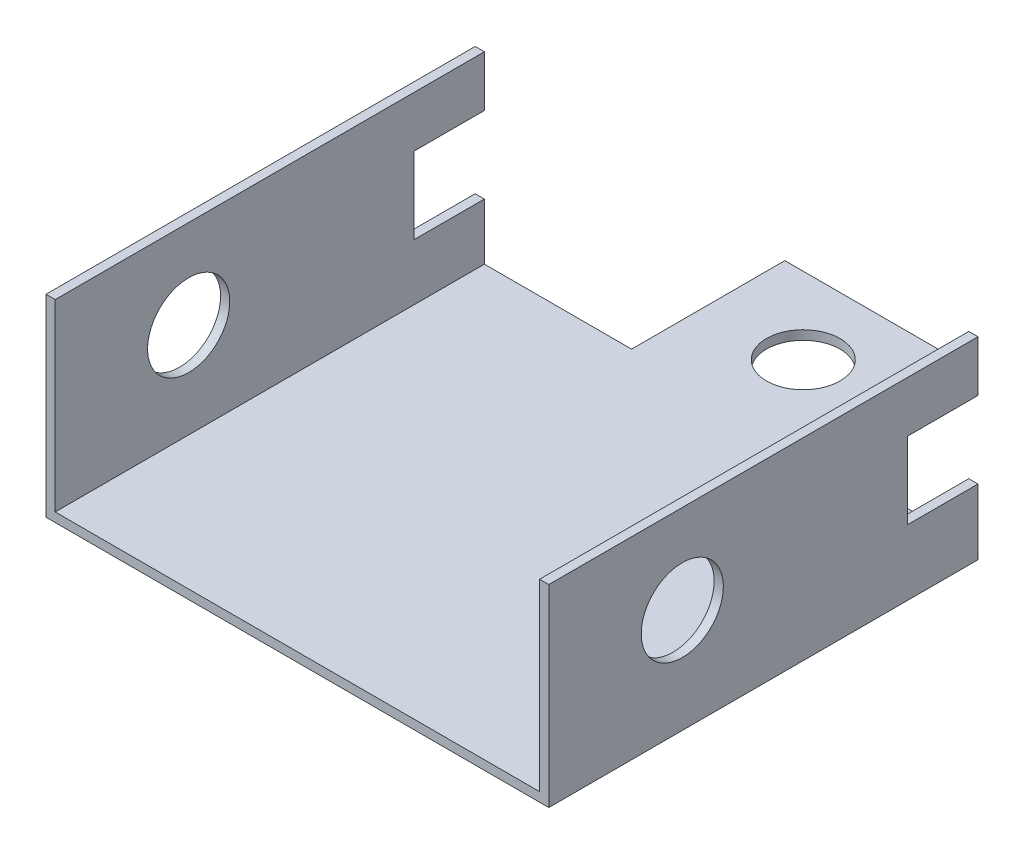
ISO-10303-21;
HEADER;
FILE_DESCRIPTION(('STEP AP214'),'2;1');
FILE_NAME('part.step','',(''),(''),'','','');
FILE_SCHEMA(('AUTOMOTIVE_DESIGN { 1 0 10303 214 1 1 1 1 }'));
ENDSEC;
DATA;
#1=APPLICATION_CONTEXT('core data for automotive mechanical design processes');
#2=APPLICATION_PROTOCOL_DEFINITION('international standard','automotive_design',2000,#1);
#3=PRODUCT_CONTEXT('',#1,'mechanical');
#4=PRODUCT('Part','Part','',(#3));
#5=PRODUCT_RELATED_PRODUCT_CATEGORY('part','',(#4));
#6=PRODUCT_DEFINITION_FORMATION('','',#4);
#7=PRODUCT_DEFINITION_CONTEXT('part definition',#1,'design');
#8=PRODUCT_DEFINITION('design','',#6,#7);
#9=PRODUCT_DEFINITION_SHAPE('','',#8);
#10=(LENGTH_UNIT() NAMED_UNIT(*) SI_UNIT(.MILLI.,.METRE.));
#11=(NAMED_UNIT(*) PLANE_ANGLE_UNIT() SI_UNIT($,.RADIAN.));
#12=(NAMED_UNIT(*) SI_UNIT($,.STERADIAN.) SOLID_ANGLE_UNIT());
#13=UNCERTAINTY_MEASURE_WITH_UNIT(LENGTH_MEASURE(1.E-05),#10,'distance_accuracy_value','');
#14=(GEOMETRIC_REPRESENTATION_CONTEXT(3) GLOBAL_UNCERTAINTY_ASSIGNED_CONTEXT((#13)) GLOBAL_UNIT_ASSIGNED_CONTEXT((#10,
#11,#12)) REPRESENTATION_CONTEXT('',''));
#15=CARTESIAN_POINT('',(0.,0.,0.));
#16=DIRECTION('',(0.,0.,1.));
#17=DIRECTION('',(1.,0.,0.));
#18=AXIS2_PLACEMENT_3D('',#15,#16,#17);
#19=CARTESIAN_POINT('',(-27.7292319944254,1.5,-11.9300184162063));
#20=DIRECTION('',(0.,0.,1.));
#21=DIRECTION('',(1.,0.,0.));
#22=AXIS2_PLACEMENT_3D('',#19,#20,#21);
#23=PLANE('',#22);
#24=DIRECTION('',(-1.,0.,0.));
#25=VECTOR('',#24,1.);
#26=CARTESIAN_POINT('',(-27.7292319944254,1.5,-11.9300184162063));
#27=LINE('',#26,#25);
#28=CARTESIAN_POINT('',(-2.22923199442536,1.5,-11.9300184162063));
#29=VERTEX_POINT('',#28);
#30=CARTESIAN_POINT('',(-26.2292319944254,1.5,-11.9300184162063));
#31=VERTEX_POINT('',#30);
#32=EDGE_CURVE('E56',#29,#31,#27,.T.);
#33=ORIENTED_EDGE('',*,*,#32,.F.);
#34=DIRECTION('',(0.,1.,0.));
#35=VECTOR('',#34,1.);
#36=CARTESIAN_POINT('',(-2.22923199442536,0.,-11.9300184162063));
#37=LINE('',#36,#35);
#38=CARTESIAN_POINT('',(-2.22923199442536,0.,-11.9300184162063));
#39=VERTEX_POINT('',#38);
#40=EDGE_CURVE('E195',#39,#29,#37,.T.);
#41=ORIENTED_EDGE('',*,*,#40,.F.);
#42=DIRECTION('',(-1.,0.,0.));
#43=VECTOR('',#42,1.);
#44=CARTESIAN_POINT('',(-27.7292319944254,0.,-11.9300184162063));
#45=LINE('',#44,#43);
#46=CARTESIAN_POINT('',(-27.7292319944254,0.,-11.9300184162063));
#47=VERTEX_POINT('',#46);
#48=EDGE_CURVE('E180',#39,#47,#45,.T.);
#49=ORIENTED_EDGE('',*,*,#48,.T.);
#50=DIRECTION('',(0.,-1.,0.));
#51=VECTOR('',#50,1.);
#52=CARTESIAN_POINT('',(-27.7292319944254,1.5,-11.9300184162063));
#53=LINE('',#52,#51);
#54=CARTESIAN_POINT('',(-27.7292319944254,10.7,-11.9300184162063));
#55=VERTEX_POINT('',#54);
#56=EDGE_CURVE('E359',#55,#47,#53,.T.);
#57=ORIENTED_EDGE('',*,*,#56,.F.);
#58=DIRECTION('',(1.,0.,0.));
#59=VECTOR('',#58,1.);
#60=CARTESIAN_POINT('',(-35.7292319944254,10.7,-11.9300184162063));
#61=LINE('',#60,#59);
#62=CARTESIAN_POINT('',(-26.2292319944254,10.7,-11.9300184162063));
#63=VERTEX_POINT('',#62);
#64=EDGE_CURVE('E263',#55,#63,#61,.T.);
#65=ORIENTED_EDGE('',*,*,#64,.T.);
#66=DIRECTION('',(0.,-1.,0.));
#67=VECTOR('',#66,1.);
#68=CARTESIAN_POINT('',(-26.2292319944254,31.5,-11.9300184162063));
#69=LINE('',#68,#67);
#70=EDGE_CURVE('E314',#63,#31,#69,.T.);
#71=ORIENTED_EDGE('',*,*,#70,.T.);
#72=EDGE_LOOP('',(#33,#41,#49,#57,#65,#71));
#73=FACE_BOUND('',#72,.T.);
#74=ADVANCED_FACE('F39',(#73),#23,.F.);
#75=CARTESIAN_POINT('',(54.2707680055746,0.,-11.9300184162063));
#76=VERTEX_POINT('',#75);
#77=CARTESIAN_POINT('',(28.7707680055746,0.,-11.9300184162063));
#78=VERTEX_POINT('',#77);
#79=EDGE_CURVE('E192',#76,#78,#45,.T.);
#80=ORIENTED_EDGE('',*,*,#79,.T.);
#81=DIRECTION('',(0.,1.,0.));
#82=VECTOR('',#81,1.);
#83=CARTESIAN_POINT('',(28.7707680055746,0.,-11.9300184162063));
#84=LINE('',#83,#82);
#85=CARTESIAN_POINT('',(28.7707680055746,1.5,-11.9300184162063));
#86=VERTEX_POINT('',#85);
#87=EDGE_CURVE('E64',#78,#86,#84,.T.);
#88=ORIENTED_EDGE('',*,*,#87,.T.);
#89=CARTESIAN_POINT('',(52.7707680055746,1.5,-11.9300184162063));
#90=VERTEX_POINT('',#89);
#91=EDGE_CURVE('E356',#90,#86,#27,.T.);
#92=ORIENTED_EDGE('',*,*,#91,.F.);
#93=DIRECTION('',(0.,-1.,0.));
#94=VECTOR('',#93,1.);
#95=CARTESIAN_POINT('',(52.7707680055746,31.5,-11.9300184162063));
#96=LINE('',#95,#94);
#97=CARTESIAN_POINT('',(52.7707680055746,10.7,-11.9300184162063));
#98=VERTEX_POINT('',#97);
#99=EDGE_CURVE('E348',#98,#90,#96,.T.);
#100=ORIENTED_EDGE('',*,*,#99,.F.);
#101=CARTESIAN_POINT('',(54.2707680055746,10.7,-11.9300184162063));
#102=VERTEX_POINT('',#101);
#103=EDGE_CURVE('E259',#98,#102,#61,.T.);
#104=ORIENTED_EDGE('',*,*,#103,.T.);
#105=DIRECTION('',(0.,-1.,0.));
#106=VECTOR('',#105,1.);
#107=CARTESIAN_POINT('',(54.2707680055746,1.5,-11.9300184162063));
#108=LINE('',#107,#106);
#109=EDGE_CURVE('E373',#102,#76,#108,.T.);
#110=ORIENTED_EDGE('',*,*,#109,.T.);
#111=EDGE_LOOP('',(#80,#88,#92,#100,#104,#110));
#112=FACE_BOUND('',#111,.T.);
#113=ADVANCED_FACE('F475',(#112),#23,.F.);
#114=CARTESIAN_POINT('',(54.2707680055746,31.5,-11.9300184162063));
#115=VERTEX_POINT('',#114);
#116=CARTESIAN_POINT('',(54.2707680055746,23.2,-11.9300184162063));
#117=VERTEX_POINT('',#116);
#118=EDGE_CURVE('E374',#115,#117,#108,.T.);
#119=ORIENTED_EDGE('',*,*,#118,.T.);
#120=DIRECTION('',(1.,0.,0.));
#121=VECTOR('',#120,1.);
#122=CARTESIAN_POINT('',(-35.7292319944254,23.2,-11.9300184162063));
#123=LINE('',#122,#121);
#124=CARTESIAN_POINT('',(52.7707680055746,23.2,-11.9300184162063));
#125=VERTEX_POINT('',#124);
#126=EDGE_CURVE('E258',#125,#117,#123,.T.);
#127=ORIENTED_EDGE('',*,*,#126,.F.);
#128=CARTESIAN_POINT('',(52.7707680055746,31.5,-11.9300184162063));
#129=VERTEX_POINT('',#128);
#130=EDGE_CURVE('E349',#129,#125,#96,.T.);
#131=ORIENTED_EDGE('',*,*,#130,.F.);
#132=DIRECTION('',(-1.,0.,0.));
#133=VECTOR('',#132,1.);
#134=CARTESIAN_POINT('',(54.2707680055746,31.5,-11.9300184162063));
#135=LINE('',#134,#133);
#136=EDGE_CURVE('E331',#115,#129,#135,.T.);
#137=ORIENTED_EDGE('',*,*,#136,.F.);
#138=EDGE_LOOP('',(#119,#127,#131,#137));
#139=FACE_BOUND('',#138,.T.);
#140=ADVANCED_FACE('F481',(#139),#23,.F.);
#141=CARTESIAN_POINT('',(0.,1.5,0.));
#142=DIRECTION('',(0.,1.,0.));
#143=DIRECTION('',(0.,0.,1.));
#144=AXIS2_PLACEMENT_3D('',#141,#142,#143);
#145=PLANE('',#144);
#146=ORIENTED_EDGE('',*,*,#91,.T.);
#147=DIRECTION('',(0.,0.,-1.));
#148=VECTOR('',#147,1.);
#149=CARTESIAN_POINT('',(28.7707680055746,1.5,-11.9300184162063));
#150=LINE('',#149,#148);
#151=CARTESIAN_POINT('',(28.7707680055746,1.5,-36.9300184162063));
#152=VERTEX_POINT('',#151);
#153=EDGE_CURVE('E213',#86,#152,#150,.T.);
#154=ORIENTED_EDGE('',*,*,#153,.T.);
#155=DIRECTION('',(-1.,0.,0.));
#156=VECTOR('',#155,1.);
#157=CARTESIAN_POINT('',(-2.22923199442537,1.5,-36.9300184162063));
#158=LINE('',#157,#156);
#159=CARTESIAN_POINT('',(-2.22923199442537,1.5,-36.9300184162063));
#160=VERTEX_POINT('',#159);
#161=EDGE_CURVE('E206',#152,#160,#158,.T.);
#162=ORIENTED_EDGE('',*,*,#161,.T.);
#163=DIRECTION('',(0.,0.,1.));
#164=VECTOR('',#163,1.);
#165=CARTESIAN_POINT('',(-2.22923199442536,1.5,-11.9300184162063));
#166=LINE('',#165,#164);
#167=EDGE_CURVE('E221',#160,#29,#166,.T.);
#168=ORIENTED_EDGE('',*,*,#167,.T.);
#169=ORIENTED_EDGE('',*,*,#32,.T.);
#170=DIRECTION('',(0.,0.,-1.));
#171=VECTOR('',#170,1.);
#172=CARTESIAN_POINT('',(-26.2292319944254,1.5,-11.9300184162063));
#173=LINE('',#172,#171);
#174=CARTESIAN_POINT('',(-26.2292319944254,1.5,58.0699815837937));
#175=VERTEX_POINT('',#174);
#176=EDGE_CURVE('E299',#175,#31,#173,.T.);
#177=ORIENTED_EDGE('',*,*,#176,.F.);
#178=DIRECTION('',(1.,0.,0.));
#179=VECTOR('',#178,1.);
#180=CARTESIAN_POINT('',(-27.7292319944254,1.5,58.0699815837937));
#181=LINE('',#180,#179);
#182=CARTESIAN_POINT('',(52.7707680055746,1.5,58.0699815837937));
#183=VERTEX_POINT('',#182);
#184=EDGE_CURVE('E353',#175,#183,#181,.T.);
#185=ORIENTED_EDGE('',*,*,#184,.T.);
#186=DIRECTION('',(0.,0.,1.));
#187=VECTOR('',#186,1.);
#188=CARTESIAN_POINT('',(52.7707680055746,1.5,-11.9300184162063));
#189=LINE('',#188,#187);
#190=EDGE_CURVE('E326',#90,#183,#189,.T.);
#191=ORIENTED_EDGE('',*,*,#190,.F.);
#192=EDGE_LOOP('',(#146,#154,#162,#168,#169,#177,#185,#191));
#193=FACE_BOUND('',#192,.T.);
#194=CARTESIAN_POINT('',(13.2707680055746,1.5,-24.4300184162063));
#195=DIRECTION('',(0.,1.,0.));
#196=DIRECTION('',(0.,0.,1.));
#197=AXIS2_PLACEMENT_3D('',#194,#195,#196);
#198=CIRCLE('',#197,6.);
#199=CARTESIAN_POINT('',(13.2707680055746,1.5,-18.4300184162063));
#200=VERTEX_POINT('',#199);
#201=EDGE_CURVE('E216',#200,#200,#198,.T.);
#202=ORIENTED_EDGE('',*,*,#201,.F.);
#203=EDGE_LOOP('',(#202));
#204=FACE_BOUND('',#203,.T.);
#205=ADVANCED_FACE('F425',(#193,#204),#145,.T.);
#206=CARTESIAN_POINT('',(-27.7292319944254,1.5,-11.9300184162063));
#207=DIRECTION('',(1.,0.,0.));
#208=DIRECTION('',(0.,0.,-1.));
#209=AXIS2_PLACEMENT_3D('',#206,#207,#208);
#210=PLANE('',#209);
#211=CARTESIAN_POINT('',(-27.7292319944254,17.,36.3018434627654));
#212=DIRECTION('',(1.,0.,0.));
#213=DIRECTION('',(0.,0.,-1.));
#214=AXIS2_PLACEMENT_3D('',#211,#212,#213);
#215=CIRCLE('',#214,6.7);
#216=CARTESIAN_POINT('',(-27.7292319944254,17.,29.6018434627654));
#217=VERTEX_POINT('',#216);
#218=EDGE_CURVE('E243',#217,#217,#215,.T.);
#219=ORIENTED_EDGE('',*,*,#218,.T.);
#220=EDGE_LOOP('',(#219));
#221=FACE_BOUND('',#220,.T.);
#222=DIRECTION('',(0.,-1.,0.));
#223=VECTOR('',#222,1.);
#224=CARTESIAN_POINT('',(-27.7292319944254,1.5,-0.430018416206268));
#225=LINE('',#224,#223);
#226=CARTESIAN_POINT('',(-27.7292319944254,23.2,-0.430018416206265));
#227=VERTEX_POINT('',#226);
#228=CARTESIAN_POINT('',(-27.7292319944254,10.7,-0.430018416206266));
#229=VERTEX_POINT('',#228);
#230=EDGE_CURVE('E287',#227,#229,#225,.T.);
#231=ORIENTED_EDGE('',*,*,#230,.T.);
#232=DIRECTION('',(0.,0.,-1.));
#233=VECTOR('',#232,1.);
#234=CARTESIAN_POINT('',(-27.7292319944254,10.7,-11.9300184162063));
#235=LINE('',#234,#233);
#236=EDGE_CURVE('E295',#229,#55,#235,.T.);
#237=ORIENTED_EDGE('',*,*,#236,.T.);
#238=ORIENTED_EDGE('',*,*,#56,.T.);
#239=DIRECTION('',(0.,0.,1.));
#240=VECTOR('',#239,1.);
#241=CARTESIAN_POINT('',(-27.7292319944254,0.,-11.9300184162063));
#242=LINE('',#241,#240);
#243=CARTESIAN_POINT('',(-27.7292319944254,0.,58.0699815837937));
#244=VERTEX_POINT('',#243);
#245=EDGE_CURVE('E188',#47,#244,#242,.T.);
#246=ORIENTED_EDGE('',*,*,#245,.T.);
#247=DIRECTION('',(0.,-1.,0.));
#248=VECTOR('',#247,1.);
#249=CARTESIAN_POINT('',(-27.7292319944254,1.5,58.0699815837937));
#250=LINE('',#249,#248);
#251=CARTESIAN_POINT('',(-27.7292319944254,31.5,58.0699815837937));
#252=VERTEX_POINT('',#251);
#253=EDGE_CURVE('E382',#252,#244,#250,.T.);
#254=ORIENTED_EDGE('',*,*,#253,.F.);
#255=DIRECTION('',(0.,0.,1.));
#256=VECTOR('',#255,1.);
#257=CARTESIAN_POINT('',(-27.7292319944254,31.5,-11.9300184162063));
#258=LINE('',#257,#256);
#259=CARTESIAN_POINT('',(-27.7292319944254,31.5,-11.9300184162063));
#260=VERTEX_POINT('',#259);
#261=EDGE_CURVE('E300',#260,#252,#258,.T.);
#262=ORIENTED_EDGE('',*,*,#261,.F.);
#263=CARTESIAN_POINT('',(-27.7292319944254,23.2,-11.9300184162063));
#264=VERTEX_POINT('',#263);
#265=EDGE_CURVE('E369',#260,#264,#53,.T.);
#266=ORIENTED_EDGE('',*,*,#265,.T.);
#267=DIRECTION('',(0.,0.,1.));
#268=VECTOR('',#267,1.);
#269=CARTESIAN_POINT('',(-27.7292319944254,23.2,-11.9300184162063));
#270=LINE('',#269,#268);
#271=EDGE_CURVE('E279',#264,#227,#270,.T.);
#272=ORIENTED_EDGE('',*,*,#271,.T.);
#273=EDGE_LOOP('',(#231,#237,#238,#246,#254,#262,#266,#272));
#274=FACE_BOUND('',#273,.T.);
#275=ADVANCED_FACE('F41',(#221,#274),#210,.F.);
#276=CARTESIAN_POINT('',(-27.7292319944254,1.5,58.0699815837937));
#277=DIRECTION('',(0.,0.,-1.));
#278=DIRECTION('',(-1.,0.,0.));
#279=AXIS2_PLACEMENT_3D('',#276,#277,#278);
#280=PLANE('',#279);
#281=DIRECTION('',(1.,0.,0.));
#282=VECTOR('',#281,1.);
#283=CARTESIAN_POINT('',(-27.7292319944254,0.,58.0699815837937));
#284=LINE('',#283,#282);
#285=CARTESIAN_POINT('',(54.2707680055746,0.,58.0699815837937));
#286=VERTEX_POINT('',#285);
#287=EDGE_CURVE('E362',#244,#286,#284,.T.);
#288=ORIENTED_EDGE('',*,*,#287,.T.);
#289=DIRECTION('',(0.,-1.,0.));
#290=VECTOR('',#289,1.);
#291=CARTESIAN_POINT('',(54.2707680055746,1.5,58.0699815837937));
#292=LINE('',#291,#290);
#293=CARTESIAN_POINT('',(54.2707680055746,31.5,58.0699815837937));
#294=VERTEX_POINT('',#293);
#295=EDGE_CURVE('E378',#294,#286,#292,.T.);
#296=ORIENTED_EDGE('',*,*,#295,.F.);
#297=DIRECTION('',(1.,0.,0.));
#298=VECTOR('',#297,1.);
#299=CARTESIAN_POINT('',(54.2707680055746,31.5,58.0699815837937));
#300=LINE('',#299,#298);
#301=CARTESIAN_POINT('',(52.7707680055746,31.5,58.0699815837937));
#302=VERTEX_POINT('',#301);
#303=EDGE_CURVE('E337',#302,#294,#300,.T.);
#304=ORIENTED_EDGE('',*,*,#303,.F.);
#305=DIRECTION('',(0.,-1.,0.));
#306=VECTOR('',#305,1.);
#307=CARTESIAN_POINT('',(52.7707680055746,31.5,58.0699815837937));
#308=LINE('',#307,#306);
#309=EDGE_CURVE('E341',#302,#183,#308,.T.);
#310=ORIENTED_EDGE('',*,*,#309,.T.);
#311=ORIENTED_EDGE('',*,*,#184,.F.);
#312=DIRECTION('',(0.,-1.,0.));
#313=VECTOR('',#312,1.);
#314=CARTESIAN_POINT('',(-26.2292319944254,31.5,58.0699815837937));
#315=LINE('',#314,#313);
#316=CARTESIAN_POINT('',(-26.2292319944254,31.5,58.0699815837937));
#317=VERTEX_POINT('',#316);
#318=EDGE_CURVE('E322',#317,#175,#315,.T.);
#319=ORIENTED_EDGE('',*,*,#318,.F.);
#320=DIRECTION('',(1.,0.,0.));
#321=VECTOR('',#320,1.);
#322=CARTESIAN_POINT('',(-27.7292319944254,31.5,58.0699815837937));
#323=LINE('',#322,#321);
#324=EDGE_CURVE('E304',#252,#317,#323,.T.);
#325=ORIENTED_EDGE('',*,*,#324,.F.);
#326=ORIENTED_EDGE('',*,*,#253,.T.);
#327=EDGE_LOOP('',(#288,#296,#304,#310,#311,#319,#325,#326));
#328=FACE_BOUND('',#327,.T.);
#329=ADVANCED_FACE('F424',(#328),#280,.F.);
#330=CARTESIAN_POINT('',(54.2707680055746,1.5,-11.9300184162063));
#331=DIRECTION('',(-1.,0.,0.));
#332=DIRECTION('',(0.,0.,1.));
#333=AXIS2_PLACEMENT_3D('',#330,#331,#332);
#334=PLANE('',#333);
#335=CARTESIAN_POINT('',(54.2707680055746,17.,36.3018434627654));
#336=DIRECTION('',(1.,0.,0.));
#337=DIRECTION('',(0.,0.,-1.));
#338=AXIS2_PLACEMENT_3D('',#335,#336,#337);
#339=CIRCLE('',#338,6.7);
#340=CARTESIAN_POINT('',(54.2707680055746,17.,29.6018434627654));
#341=VERTEX_POINT('',#340);
#342=EDGE_CURVE('E230',#341,#341,#339,.T.);
#343=ORIENTED_EDGE('',*,*,#342,.F.);
#344=EDGE_LOOP('',(#343));
#345=FACE_BOUND('',#344,.T.);
#346=ORIENTED_EDGE('',*,*,#109,.F.);
#347=DIRECTION('',(0.,0.,-1.));
#348=VECTOR('',#347,1.);
#349=CARTESIAN_POINT('',(54.2707680055746,10.7,-11.9300184162063));
#350=LINE('',#349,#348);
#351=CARTESIAN_POINT('',(54.2707680055746,10.7,-0.430018416206266));
#352=VERTEX_POINT('',#351);
#353=EDGE_CURVE('E255',#352,#102,#350,.T.);
#354=ORIENTED_EDGE('',*,*,#353,.F.);
#355=DIRECTION('',(0.,-1.,0.));
#356=VECTOR('',#355,1.);
#357=CARTESIAN_POINT('',(54.2707680055746,23.2,-0.430018416206265));
#358=LINE('',#357,#356);
#359=CARTESIAN_POINT('',(54.2707680055746,23.2,-0.430018416206265));
#360=VERTEX_POINT('',#359);
#361=EDGE_CURVE('E251',#360,#352,#358,.T.);
#362=ORIENTED_EDGE('',*,*,#361,.F.);
#363=DIRECTION('',(0.,0.,1.));
#364=VECTOR('',#363,1.);
#365=CARTESIAN_POINT('',(54.2707680055746,23.2,-11.9300184162063));
#366=LINE('',#365,#364);
#367=EDGE_CURVE('E247',#117,#360,#366,.T.);
#368=ORIENTED_EDGE('',*,*,#367,.F.);
#369=ORIENTED_EDGE('',*,*,#118,.F.);
#370=DIRECTION('',(0.,0.,-1.));
#371=VECTOR('',#370,1.);
#372=CARTESIAN_POINT('',(54.2707680055746,31.5,-11.9300184162063));
#373=LINE('',#372,#371);
#374=EDGE_CURVE('E327',#294,#115,#373,.T.);
#375=ORIENTED_EDGE('',*,*,#374,.F.);
#376=ORIENTED_EDGE('',*,*,#295,.T.);
#377=DIRECTION('',(0.,0.,-1.));
#378=VECTOR('',#377,1.);
#379=CARTESIAN_POINT('',(54.2707680055746,0.,-11.9300184162063));
#380=LINE('',#379,#378);
#381=EDGE_CURVE('E193',#286,#76,#380,.T.);
#382=ORIENTED_EDGE('',*,*,#381,.T.);
#383=EDGE_LOOP('',(#346,#354,#362,#368,#369,#375,#376,#382));
#384=FACE_BOUND('',#383,.T.);
#385=ADVANCED_FACE('F485',(#345,#384),#334,.F.);
#386=CARTESIAN_POINT('',(-26.2292319944254,31.5,-11.9300184162063));
#387=VERTEX_POINT('',#386);
#388=CARTESIAN_POINT('',(-26.2292319944254,23.2,-11.9300184162063));
#389=VERTEX_POINT('',#388);
#390=EDGE_CURVE('E318',#387,#389,#69,.T.);
#391=ORIENTED_EDGE('',*,*,#390,.T.);
#392=EDGE_CURVE('E272',#264,#389,#123,.T.);
#393=ORIENTED_EDGE('',*,*,#392,.F.);
#394=ORIENTED_EDGE('',*,*,#265,.F.);
#395=DIRECTION('',(-1.,0.,0.));
#396=VECTOR('',#395,1.);
#397=CARTESIAN_POINT('',(-27.7292319944254,31.5,-11.9300184162063));
#398=LINE('',#397,#396);
#399=EDGE_CURVE('E310',#387,#260,#398,.T.);
#400=ORIENTED_EDGE('',*,*,#399,.F.);
#401=EDGE_LOOP('',(#391,#393,#394,#400));
#402=FACE_BOUND('',#401,.T.);
#403=ADVANCED_FACE('F430',(#402),#23,.F.);
#404=CARTESIAN_POINT('',(0.,0.,0.));
#405=DIRECTION('',(0.,1.,0.));
#406=DIRECTION('',(0.,0.,1.));
#407=AXIS2_PLACEMENT_3D('',#404,#405,#406);
#408=PLANE('',#407);
#409=ORIENTED_EDGE('',*,*,#245,.F.);
#410=ORIENTED_EDGE('',*,*,#48,.F.);
#411=DIRECTION('',(0.,0.,1.));
#412=VECTOR('',#411,1.);
#413=CARTESIAN_POINT('',(-2.22923199442536,0.,-11.9300184162063));
#414=LINE('',#413,#412);
#415=CARTESIAN_POINT('',(-2.22923199442537,0.,-36.9300184162063));
#416=VERTEX_POINT('',#415);
#417=EDGE_CURVE('E185',#416,#39,#414,.T.);
#418=ORIENTED_EDGE('',*,*,#417,.F.);
#419=DIRECTION('',(-1.,0.,0.));
#420=VECTOR('',#419,1.);
#421=CARTESIAN_POINT('',(-2.22923199442537,0.,-36.9300184162063));
#422=LINE('',#421,#420);
#423=CARTESIAN_POINT('',(28.7707680055746,0.,-36.9300184162063));
#424=VERTEX_POINT('',#423);
#425=EDGE_CURVE('E200',#424,#416,#422,.T.);
#426=ORIENTED_EDGE('',*,*,#425,.F.);
#427=DIRECTION('',(0.,0.,-1.));
#428=VECTOR('',#427,1.);
#429=CARTESIAN_POINT('',(28.7707680055746,0.,-11.9300184162063));
#430=LINE('',#429,#428);
#431=EDGE_CURVE('E205',#78,#424,#430,.T.);
#432=ORIENTED_EDGE('',*,*,#431,.F.);
#433=ORIENTED_EDGE('',*,*,#79,.F.);
#434=ORIENTED_EDGE('',*,*,#381,.F.);
#435=ORIENTED_EDGE('',*,*,#287,.F.);
#436=EDGE_LOOP('',(#409,#410,#418,#426,#432,#433,#434,#435));
#437=FACE_BOUND('',#436,.T.);
#438=CARTESIAN_POINT('',(13.2707680055746,0.,-24.4300184162063));
#439=DIRECTION('',(0.,1.,0.));
#440=DIRECTION('',(0.,0.,1.));
#441=AXIS2_PLACEMENT_3D('',#438,#439,#440);
#442=CIRCLE('',#441,6.);
#443=CARTESIAN_POINT('',(13.2707680055746,0.,-18.4300184162063));
#444=VERTEX_POINT('',#443);
#445=EDGE_CURVE('E224',#444,#444,#442,.T.);
#446=ORIENTED_EDGE('',*,*,#445,.T.);
#447=EDGE_LOOP('',(#446));
#448=FACE_BOUND('',#447,.T.);
#449=ADVANCED_FACE('F181',(#437,#448),#408,.F.);
#450=CARTESIAN_POINT('',(52.7707680055746,31.5,-11.9300184162063));
#451=DIRECTION('',(1.,0.,0.));
#452=DIRECTION('',(0.,0.,-1.));
#453=AXIS2_PLACEMENT_3D('',#450,#451,#452);
#454=PLANE('',#453);
#455=CARTESIAN_POINT('',(52.7707680055746,17.,36.3018434627654));
#456=DIRECTION('',(1.,0.,0.));
#457=DIRECTION('',(0.,0.,-1.));
#458=AXIS2_PLACEMENT_3D('',#455,#456,#457);
#459=CIRCLE('',#458,6.7);
#460=CARTESIAN_POINT('',(52.7707680055746,17.,29.6018434627654));
#461=VERTEX_POINT('',#460);
#462=EDGE_CURVE('E239',#461,#461,#459,.T.);
#463=ORIENTED_EDGE('',*,*,#462,.T.);
#464=EDGE_LOOP('',(#463));
#465=FACE_BOUND('',#464,.T.);
#466=DIRECTION('',(0.,-1.,0.));
#467=VECTOR('',#466,1.);
#468=CARTESIAN_POINT('',(52.7707680055746,31.5,-0.430018416206263));
#469=LINE('',#468,#467);
#470=CARTESIAN_POINT('',(52.7707680055746,23.2,-0.430018416206265));
#471=VERTEX_POINT('',#470);
#472=CARTESIAN_POINT('',(52.7707680055746,10.7,-0.430018416206266));
#473=VERTEX_POINT('',#472);
#474=EDGE_CURVE('E283',#471,#473,#469,.T.);
#475=ORIENTED_EDGE('',*,*,#474,.T.);
#476=DIRECTION('',(0.,0.,-1.));
#477=VECTOR('',#476,1.);
#478=CARTESIAN_POINT('',(52.7707680055746,10.7,-11.9300184162063));
#479=LINE('',#478,#477);
#480=EDGE_CURVE('E291',#473,#98,#479,.T.);
#481=ORIENTED_EDGE('',*,*,#480,.T.);
#482=ORIENTED_EDGE('',*,*,#99,.T.);
#483=ORIENTED_EDGE('',*,*,#190,.T.);
#484=ORIENTED_EDGE('',*,*,#309,.F.);
#485=DIRECTION('',(0.,0.,1.));
#486=VECTOR('',#485,1.);
#487=CARTESIAN_POINT('',(52.7707680055746,31.5,-11.9300184162063));
#488=LINE('',#487,#486);
#489=EDGE_CURVE('E334',#129,#302,#488,.T.);
#490=ORIENTED_EDGE('',*,*,#489,.F.);
#491=ORIENTED_EDGE('',*,*,#130,.T.);
#492=DIRECTION('',(0.,0.,1.));
#493=VECTOR('',#492,1.);
#494=CARTESIAN_POINT('',(52.7707680055746,23.2,-11.9300184162063));
#495=LINE('',#494,#493);
#496=EDGE_CURVE('E275',#125,#471,#495,.T.);
#497=ORIENTED_EDGE('',*,*,#496,.T.);
#498=EDGE_LOOP('',(#475,#481,#482,#483,#484,#490,#491,#497));
#499=FACE_BOUND('',#498,.T.);
#500=ADVANCED_FACE('F446',(#465,#499),#454,.F.);
#501=CARTESIAN_POINT('',(0.,31.5,0.));
#502=DIRECTION('',(0.,-1.,0.));
#503=DIRECTION('',(0.,0.,-1.));
#504=AXIS2_PLACEMENT_3D('',#501,#502,#503);
#505=PLANE('',#504);
#506=ORIENTED_EDGE('',*,*,#374,.T.);
#507=ORIENTED_EDGE('',*,*,#136,.T.);
#508=ORIENTED_EDGE('',*,*,#489,.T.);
#509=ORIENTED_EDGE('',*,*,#303,.T.);
#510=EDGE_LOOP('',(#506,#507,#508,#509));
#511=FACE_BOUND('',#510,.T.);
#512=ADVANCED_FACE('F511',(#511),#505,.F.);
#513=CARTESIAN_POINT('',(-26.2292319944254,31.5,-11.9300184162063));
#514=DIRECTION('',(-1.,0.,0.));
#515=DIRECTION('',(0.,0.,1.));
#516=AXIS2_PLACEMENT_3D('',#513,#514,#515);
#517=PLANE('',#516);
#518=CARTESIAN_POINT('',(-26.2292319944254,17.,36.3018434627654));
#519=DIRECTION('',(-1.,0.,0.));
#520=DIRECTION('',(0.,0.,1.));
#521=AXIS2_PLACEMENT_3D('',#518,#519,#520);
#522=CIRCLE('',#521,6.7);
#523=CARTESIAN_POINT('',(-26.2292319944254,17.,29.6018434627654));
#524=VERTEX_POINT('',#523);
#525=EDGE_CURVE('E43',#524,#524,#522,.T.);
#526=ORIENTED_EDGE('',*,*,#525,.T.);
#527=EDGE_LOOP('',(#526));
#528=FACE_BOUND('',#527,.T.);
#529=ORIENTED_EDGE('',*,*,#70,.F.);
#530=DIRECTION('',(0.,0.,1.));
#531=VECTOR('',#530,1.);
#532=CARTESIAN_POINT('',(-26.2292319944254,10.7,-11.9300184162063));
#533=LINE('',#532,#531);
#534=CARTESIAN_POINT('',(-26.2292319944254,10.7,-0.430018416206266));
#535=VERTEX_POINT('',#534);
#536=EDGE_CURVE('E11',#63,#535,#533,.T.);
#537=ORIENTED_EDGE('',*,*,#536,.T.);
#538=DIRECTION('',(0.,1.,0.));
#539=VECTOR('',#538,1.);
#540=CARTESIAN_POINT('',(-26.2292319944254,31.5,-0.430018416206263));
#541=LINE('',#540,#539);
#542=CARTESIAN_POINT('',(-26.2292319944254,23.2,-0.430018416206265));
#543=VERTEX_POINT('',#542);
#544=EDGE_CURVE('E49',#535,#543,#541,.T.);
#545=ORIENTED_EDGE('',*,*,#544,.T.);
#546=DIRECTION('',(0.,0.,-1.));
#547=VECTOR('',#546,1.);
#548=CARTESIAN_POINT('',(-26.2292319944254,23.2,-11.9300184162063));
#549=LINE('',#548,#547);
#550=EDGE_CURVE('E386',#543,#389,#549,.T.);
#551=ORIENTED_EDGE('',*,*,#550,.T.);
#552=ORIENTED_EDGE('',*,*,#390,.F.);
#553=DIRECTION('',(0.,0.,-1.));
#554=VECTOR('',#553,1.);
#555=CARTESIAN_POINT('',(-26.2292319944254,31.5,-11.9300184162063));
#556=LINE('',#555,#554);
#557=EDGE_CURVE('E307',#317,#387,#556,.T.);
#558=ORIENTED_EDGE('',*,*,#557,.F.);
#559=ORIENTED_EDGE('',*,*,#318,.T.);
#560=ORIENTED_EDGE('',*,*,#176,.T.);
#561=EDGE_LOOP('',(#529,#537,#545,#551,#552,#558,#559,#560));
#562=FACE_BOUND('',#561,.T.);
#563=ADVANCED_FACE('F394',(#528,#562),#517,.F.);
#564=CARTESIAN_POINT('',(0.,31.5,0.));
#565=DIRECTION('',(0.,1.,0.));
#566=DIRECTION('',(0.,0.,1.));
#567=AXIS2_PLACEMENT_3D('',#564,#565,#566);
#568=PLANE('',#567);
#569=ORIENTED_EDGE('',*,*,#261,.T.);
#570=ORIENTED_EDGE('',*,*,#324,.T.);
#571=ORIENTED_EDGE('',*,*,#557,.T.);
#572=ORIENTED_EDGE('',*,*,#399,.T.);
#573=EDGE_LOOP('',(#569,#570,#571,#572));
#574=FACE_BOUND('',#573,.T.);
#575=ADVANCED_FACE('F435',(#574),#568,.T.);
#576=CARTESIAN_POINT('',(-35.7292319944254,23.2,-11.9300184162063));
#577=DIRECTION('',(0.,1.,0.));
#578=DIRECTION('',(0.,0.,1.));
#579=AXIS2_PLACEMENT_3D('',#576,#577,#578);
#580=PLANE('',#579);
#581=ORIENTED_EDGE('',*,*,#392,.T.);
#582=ORIENTED_EDGE('',*,*,#550,.F.);
#583=DIRECTION('',(1.,0.,0.));
#584=VECTOR('',#583,1.);
#585=CARTESIAN_POINT('',(-35.7292319944254,23.2,-0.430018416206265));
#586=LINE('',#585,#584);
#587=EDGE_CURVE('E268',#227,#543,#586,.T.);
#588=ORIENTED_EDGE('',*,*,#587,.F.);
#589=ORIENTED_EDGE('',*,*,#271,.F.);
#590=EDGE_LOOP('',(#581,#582,#588,#589));
#591=FACE_BOUND('',#590,.T.);
#592=ADVANCED_FACE('F427',(#591),#580,.F.);
#593=CARTESIAN_POINT('',(-35.7292319944254,23.2,-0.430018416206265));
#594=DIRECTION('',(0.,0.,1.));
#595=DIRECTION('',(0.,-1.,0.));
#596=AXIS2_PLACEMENT_3D('',#593,#594,#595);
#597=PLANE('',#596);
#598=ORIENTED_EDGE('',*,*,#587,.T.);
#599=ORIENTED_EDGE('',*,*,#544,.F.);
#600=DIRECTION('',(1.,0.,0.));
#601=VECTOR('',#600,1.);
#602=CARTESIAN_POINT('',(-35.7292319944254,10.7,-0.430018416206266));
#603=LINE('',#602,#601);
#604=EDGE_CURVE('E264',#229,#535,#603,.T.);
#605=ORIENTED_EDGE('',*,*,#604,.F.);
#606=ORIENTED_EDGE('',*,*,#230,.F.);
#607=EDGE_LOOP('',(#598,#599,#605,#606));
#608=FACE_BOUND('',#607,.T.);
#609=ADVANCED_FACE('F400',(#608),#597,.F.);
#610=CARTESIAN_POINT('',(-35.7292319944254,10.7,-11.9300184162063));
#611=DIRECTION('',(0.,-1.,0.));
#612=DIRECTION('',(0.,0.,-1.));
#613=AXIS2_PLACEMENT_3D('',#610,#611,#612);
#614=PLANE('',#613);
#615=ORIENTED_EDGE('',*,*,#604,.T.);
#616=ORIENTED_EDGE('',*,*,#536,.F.);
#617=ORIENTED_EDGE('',*,*,#64,.F.);
#618=ORIENTED_EDGE('',*,*,#236,.F.);
#619=EDGE_LOOP('',(#615,#616,#617,#618));
#620=FACE_BOUND('',#619,.T.);
#621=ADVANCED_FACE('F403',(#620),#614,.F.);
#622=EDGE_CURVE('E265',#473,#352,#603,.T.);
#623=ORIENTED_EDGE('',*,*,#622,.T.);
#624=ORIENTED_EDGE('',*,*,#353,.T.);
#625=ORIENTED_EDGE('',*,*,#103,.F.);
#626=ORIENTED_EDGE('',*,*,#480,.F.);
#627=EDGE_LOOP('',(#623,#624,#625,#626));
#628=FACE_BOUND('',#627,.T.);
#629=ADVANCED_FACE('F513',(#628),#614,.F.);
#630=EDGE_CURVE('E269',#471,#360,#586,.T.);
#631=ORIENTED_EDGE('',*,*,#630,.T.);
#632=ORIENTED_EDGE('',*,*,#361,.T.);
#633=ORIENTED_EDGE('',*,*,#622,.F.);
#634=ORIENTED_EDGE('',*,*,#474,.F.);
#635=EDGE_LOOP('',(#631,#632,#633,#634));
#636=FACE_BOUND('',#635,.T.);
#637=ADVANCED_FACE('F516',(#636),#597,.F.);
#638=ORIENTED_EDGE('',*,*,#126,.T.);
#639=ORIENTED_EDGE('',*,*,#367,.T.);
#640=ORIENTED_EDGE('',*,*,#630,.F.);
#641=ORIENTED_EDGE('',*,*,#496,.F.);
#642=EDGE_LOOP('',(#638,#639,#640,#641));
#643=FACE_BOUND('',#642,.T.);
#644=ADVANCED_FACE('F418',(#643),#580,.F.);
#645=CARTESIAN_POINT('',(-35.7292319944254,17.,36.3018434627654));
#646=DIRECTION('',(1.,0.,0.));
#647=DIRECTION('',(0.,0.,-1.));
#648=AXIS2_PLACEMENT_3D('',#645,#646,#647);
#649=CYLINDRICAL_SURFACE('',#648,6.7);
#650=CARTESIAN_POINT('',(-26.2292319944254,17.,29.6018434627654));
#651=CARTESIAN_POINT('',(-26.2448569944254,17.,29.6018434627654));
#652=CARTESIAN_POINT('',(-26.2604819944254,17.,29.6018434627654));
#653=CARTESIAN_POINT('',(-26.2917319944254,17.,29.6018434627654));
#654=CARTESIAN_POINT('',(-26.3073569944254,17.,29.6018434627654));
#655=CARTESIAN_POINT('',(-26.3386069944254,17.,29.6018434627654));
#656=CARTESIAN_POINT('',(-26.3542319944254,17.,29.6018434627654));
#657=CARTESIAN_POINT('',(-26.3854819944254,17.,29.6018434627654));
#658=CARTESIAN_POINT('',(-26.4011069944254,17.,29.6018434627654));
#659=CARTESIAN_POINT('',(-26.4323569944254,17.,29.6018434627654));
#660=CARTESIAN_POINT('',(-26.4479819944254,17.,29.6018434627654));
#661=CARTESIAN_POINT('',(-26.4792319944254,17.,29.6018434627654));
#662=CARTESIAN_POINT('',(-26.4948569944254,17.,29.6018434627654));
#663=CARTESIAN_POINT('',(-26.5261069944254,17.,29.6018434627654));
#664=CARTESIAN_POINT('',(-26.5417319944254,17.,29.6018434627654));
#665=CARTESIAN_POINT('',(-26.5729819944254,17.,29.6018434627654));
#666=CARTESIAN_POINT('',(-26.5886069944254,17.,29.6018434627654));
#667=CARTESIAN_POINT('',(-26.6198569944254,17.,29.6018434627654));
#668=CARTESIAN_POINT('',(-26.6354819944254,17.,29.6018434627654));
#669=CARTESIAN_POINT('',(-26.6667319944254,17.,29.6018434627654));
#670=CARTESIAN_POINT('',(-26.6823569944254,17.,29.6018434627654));
#671=CARTESIAN_POINT('',(-26.7136069944254,17.,29.6018434627654));
#672=CARTESIAN_POINT('',(-26.7292319944254,17.,29.6018434627654));
#673=CARTESIAN_POINT('',(-26.7604819944254,17.,29.6018434627654));
#674=CARTESIAN_POINT('',(-26.7761069944254,17.,29.6018434627654));
#675=CARTESIAN_POINT('',(-26.8073569944254,17.,29.6018434627654));
#676=CARTESIAN_POINT('',(-26.8229819944254,17.,29.6018434627654));
#677=CARTESIAN_POINT('',(-26.8542319944254,17.,29.6018434627654));
#678=CARTESIAN_POINT('',(-26.8698569944254,17.,29.6018434627654));
#679=CARTESIAN_POINT('',(-26.9011069944254,17.,29.6018434627654));
#680=CARTESIAN_POINT('',(-26.9167319944254,17.,29.6018434627654));
#681=CARTESIAN_POINT('',(-26.9479819944254,17.,29.6018434627654));
#682=CARTESIAN_POINT('',(-26.9636069944254,17.,29.6018434627654));
#683=CARTESIAN_POINT('',(-26.9948569944254,17.,29.6018434627654));
#684=CARTESIAN_POINT('',(-27.0104819944254,17.,29.6018434627654));
#685=CARTESIAN_POINT('',(-27.0417319944254,17.,29.6018434627654));
#686=CARTESIAN_POINT('',(-27.0573569944254,17.,29.6018434627654));
#687=CARTESIAN_POINT('',(-27.0886069944254,17.,29.6018434627654));
#688=CARTESIAN_POINT('',(-27.1042319944254,17.,29.6018434627654));
#689=CARTESIAN_POINT('',(-27.1354819944254,17.,29.6018434627654));
#690=CARTESIAN_POINT('',(-27.1511069944254,17.,29.6018434627654));
#691=CARTESIAN_POINT('',(-27.1823569944254,17.,29.6018434627654));
#692=CARTESIAN_POINT('',(-27.1979819944254,17.,29.6018434627654));
#693=CARTESIAN_POINT('',(-27.2292319944254,17.,29.6018434627654));
#694=CARTESIAN_POINT('',(-27.2448569944254,17.,29.6018434627654));
#695=CARTESIAN_POINT('',(-27.2761069944254,17.,29.6018434627654));
#696=CARTESIAN_POINT('',(-27.2917319944254,17.,29.6018434627654));
#697=CARTESIAN_POINT('',(-27.3229819944254,17.,29.6018434627654));
#698=CARTESIAN_POINT('',(-27.3386069944254,17.,29.6018434627654));
#699=CARTESIAN_POINT('',(-27.3698569944254,17.,29.6018434627654));
#700=CARTESIAN_POINT('',(-27.3854819944254,17.,29.6018434627654));
#701=CARTESIAN_POINT('',(-27.4167319944254,17.,29.6018434627654));
#702=CARTESIAN_POINT('',(-27.4323569944254,17.,29.6018434627654));
#703=CARTESIAN_POINT('',(-27.4636069944254,17.,29.6018434627654));
#704=CARTESIAN_POINT('',(-27.4792319944254,17.,29.6018434627654));
#705=CARTESIAN_POINT('',(-27.5104819944254,17.,29.6018434627654));
#706=CARTESIAN_POINT('',(-27.5261069944254,17.,29.6018434627654));
#707=CARTESIAN_POINT('',(-27.5573569944254,17.,29.6018434627654));
#708=CARTESIAN_POINT('',(-27.5729819944254,17.,29.6018434627654));
#709=CARTESIAN_POINT('',(-27.6042319944254,17.,29.6018434627654));
#710=CARTESIAN_POINT('',(-27.6198569944254,17.,29.6018434627654));
#711=CARTESIAN_POINT('',(-27.6511069944254,17.,29.6018434627654));
#712=CARTESIAN_POINT('',(-27.6667319944254,17.,29.6018434627654));
#713=CARTESIAN_POINT('',(-27.6979819944254,17.,29.6018434627654));
#714=CARTESIAN_POINT('',(-27.7136069944254,17.,29.6018434627654));
#715=CARTESIAN_POINT('',(-27.7292319944254,17.,29.6018434627654));
#716=B_SPLINE_CURVE_WITH_KNOTS('',3,(#650,#651,#652,#653,#654,#655,#656,#657,#658,#659,#660,
#661,#662,#663,#664,#665,#666,#667,#668,#669,#670,#671,#672,#673,#674,#675,#676,#677,#678,#679,
#680,#681,#682,#683,#684,#685,#686,#687,#688,#689,#690,#691,#692,#693,#694,#695,#696,#697,#698,
#699,#700,#701,#702,#703,#704,#705,#706,#707,#708,#709,#710,#711,#712,#713,#714,#715),
.UNSPECIFIED.,.F.,.F.,(4,2,2,2,2,2,2,2,2,2,2,2,2,2,2,2,2,2,2,2,2,2,2,2,2,2,2,2,2,2,2,2,4),(0.,
0.0468750000000018,0.0937500000000036,0.140625000000002,0.1875,0.234375000000002,
0.281250000000004,0.328125000000005,0.375000000000004,0.421875000000002,0.468750000000004,
0.515625000000006,0.562500000000007,0.609375000000006,0.656250000000004,0.703125000000006,
0.750000000000008,0.796875000000006,0.843750000000004,0.890625000000006,0.937500000000008,
0.98437500000001,1.03125000000001,1.07812500000001,1.12500000000001,1.17187500000001,
1.21875000000001,1.26562500000001,1.31250000000001,1.35937500000001,1.40625000000001,
1.45312500000001,1.50000000000001),.UNSPECIFIED.);
#717=EDGE_CURVE('BSEAM414',#524,#217,#716,.T.);
#718=ORIENTED_EDGE('',*,*,#525,.F.);
#719=ORIENTED_EDGE('',*,*,#218,.F.);
#720=ORIENTED_EDGE('',*,*,#717,.T.);
#721=ORIENTED_EDGE('',*,*,#717,.F.);
#722=EDGE_LOOP('',(#718,#720,#719,#721));
#723=FACE_BOUND('',#722,.T.);
#724=ADVANCED_FACE('F414',(#723),#649,.F.);
#725=CARTESIAN_POINT('',(54.2707680055746,17.,29.6018434627654));
#726=CARTESIAN_POINT('',(54.2551430055746,17.,29.6018434627654));
#727=CARTESIAN_POINT('',(54.2395180055746,17.,29.6018434627654));
#728=CARTESIAN_POINT('',(54.2082680055746,17.,29.6018434627654));
#729=CARTESIAN_POINT('',(54.1926430055746,17.,29.6018434627654));
#730=CARTESIAN_POINT('',(54.1613930055746,17.,29.6018434627654));
#731=CARTESIAN_POINT('',(54.1457680055746,17.,29.6018434627654));
#732=CARTESIAN_POINT('',(54.1145180055746,17.,29.6018434627654));
#733=CARTESIAN_POINT('',(54.0988930055746,17.,29.6018434627654));
#734=CARTESIAN_POINT('',(54.0676430055746,17.,29.6018434627654));
#735=CARTESIAN_POINT('',(54.0520180055746,17.,29.6018434627654));
#736=CARTESIAN_POINT('',(54.0207680055746,17.,29.6018434627654));
#737=CARTESIAN_POINT('',(54.0051430055746,17.,29.6018434627654));
#738=CARTESIAN_POINT('',(53.9738930055746,17.,29.6018434627654));
#739=CARTESIAN_POINT('',(53.9582680055746,17.,29.6018434627654));
#740=CARTESIAN_POINT('',(53.9270180055746,17.,29.6018434627654));
#741=CARTESIAN_POINT('',(53.9113930055746,17.,29.6018434627654));
#742=CARTESIAN_POINT('',(53.8801430055746,17.,29.6018434627654));
#743=CARTESIAN_POINT('',(53.8645180055746,17.,29.6018434627654));
#744=CARTESIAN_POINT('',(53.8332680055746,17.,29.6018434627654));
#745=CARTESIAN_POINT('',(53.8176430055746,17.,29.6018434627654));
#746=CARTESIAN_POINT('',(53.7863930055746,17.,29.6018434627654));
#747=CARTESIAN_POINT('',(53.7707680055746,17.,29.6018434627654));
#748=CARTESIAN_POINT('',(53.7395180055746,17.,29.6018434627654));
#749=CARTESIAN_POINT('',(53.7238930055746,17.,29.6018434627654));
#750=CARTESIAN_POINT('',(53.6926430055746,17.,29.6018434627654));
#751=CARTESIAN_POINT('',(53.6770180055746,17.,29.6018434627654));
#752=CARTESIAN_POINT('',(53.6457680055746,17.,29.6018434627654));
#753=CARTESIAN_POINT('',(53.6301430055746,17.,29.6018434627654));
#754=CARTESIAN_POINT('',(53.5988930055746,17.,29.6018434627654));
#755=CARTESIAN_POINT('',(53.5832680055746,17.,29.6018434627654));
#756=CARTESIAN_POINT('',(53.5520180055746,17.,29.6018434627654));
#757=CARTESIAN_POINT('',(53.5363930055746,17.,29.6018434627654));
#758=CARTESIAN_POINT('',(53.5051430055746,17.,29.6018434627654));
#759=CARTESIAN_POINT('',(53.4895180055746,17.,29.6018434627654));
#760=CARTESIAN_POINT('',(53.4582680055746,17.,29.6018434627654));
#761=CARTESIAN_POINT('',(53.4426430055746,17.,29.6018434627654));
#762=CARTESIAN_POINT('',(53.4113930055746,17.,29.6018434627654));
#763=CARTESIAN_POINT('',(53.3957680055746,17.,29.6018434627654));
#764=CARTESIAN_POINT('',(53.3645180055746,17.,29.6018434627654));
#765=CARTESIAN_POINT('',(53.3488930055746,17.,29.6018434627654));
#766=CARTESIAN_POINT('',(53.3176430055746,17.,29.6018434627654));
#767=CARTESIAN_POINT('',(53.3020180055746,17.,29.6018434627654));
#768=CARTESIAN_POINT('',(53.2707680055746,17.,29.6018434627654));
#769=CARTESIAN_POINT('',(53.2551430055746,17.,29.6018434627654));
#770=CARTESIAN_POINT('',(53.2238930055746,17.,29.6018434627654));
#771=CARTESIAN_POINT('',(53.2082680055746,17.,29.6018434627654));
#772=CARTESIAN_POINT('',(53.1770180055746,17.,29.6018434627654));
#773=CARTESIAN_POINT('',(53.1613930055746,17.,29.6018434627654));
#774=CARTESIAN_POINT('',(53.1301430055746,17.,29.6018434627654));
#775=CARTESIAN_POINT('',(53.1145180055746,17.,29.6018434627654));
#776=CARTESIAN_POINT('',(53.0832680055746,17.,29.6018434627654));
#777=CARTESIAN_POINT('',(53.0676430055746,17.,29.6018434627654));
#778=CARTESIAN_POINT('',(53.0363930055746,17.,29.6018434627654));
#779=CARTESIAN_POINT('',(53.0207680055746,17.,29.6018434627654));
#780=CARTESIAN_POINT('',(52.9895180055746,17.,29.6018434627654));
#781=CARTESIAN_POINT('',(52.9738930055746,17.,29.6018434627654));
#782=CARTESIAN_POINT('',(52.9426430055746,17.,29.6018434627654));
#783=CARTESIAN_POINT('',(52.9270180055746,17.,29.6018434627654));
#784=CARTESIAN_POINT('',(52.8957680055746,17.,29.6018434627654));
#785=CARTESIAN_POINT('',(52.8801430055746,17.,29.6018434627654));
#786=CARTESIAN_POINT('',(52.8488930055746,17.,29.6018434627654));
#787=CARTESIAN_POINT('',(52.8332680055746,17.,29.6018434627654));
#788=CARTESIAN_POINT('',(52.8020180055746,17.,29.6018434627654));
#789=CARTESIAN_POINT('',(52.7863930055746,17.,29.6018434627654));
#790=CARTESIAN_POINT('',(52.7707680055746,17.,29.6018434627654));
#791=B_SPLINE_CURVE_WITH_KNOTS('',3,(#725,#726,#727,#728,#729,#730,#731,#732,#733,#734,#735,
#736,#737,#738,#739,#740,#741,#742,#743,#744,#745,#746,#747,#748,#749,#750,#751,#752,#753,#754,
#755,#756,#757,#758,#759,#760,#761,#762,#763,#764,#765,#766,#767,#768,#769,#770,#771,#772,#773,
#774,#775,#776,#777,#778,#779,#780,#781,#782,#783,#784,#785,#786,#787,#788,#789,#790),
.UNSPECIFIED.,.F.,.F.,(4,2,2,2,2,2,2,2,2,2,2,2,2,2,2,2,2,2,2,2,2,2,2,2,2,2,2,2,2,2,2,2,4),(0.,
0.0468750000000018,0.0937500000000036,0.140625000000005,0.187500000000007,0.234374999999995,
0.281249999999997,0.328124999999999,0.375,0.421875000000002,0.468750000000004,0.515625000000006,
0.562499999999994,0.609374999999995,0.656249999999997,0.703124999999999,0.750000000000001,
0.796875000000002,0.843750000000004,0.890625000000006,0.937500000000008,0.984374999999996,
1.03125,1.078125,1.125,1.171875,1.21875,1.26562500000001,1.31249999999999,1.359375,1.40625,
1.453125,1.5),.UNSPECIFIED.);
#792=EDGE_CURVE('BSEAM417',#341,#461,#791,.T.);
#793=ORIENTED_EDGE('',*,*,#342,.T.);
#794=ORIENTED_EDGE('',*,*,#462,.F.);
#795=ORIENTED_EDGE('',*,*,#792,.T.);
#796=ORIENTED_EDGE('',*,*,#792,.F.);
#797=EDGE_LOOP('',(#793,#795,#794,#796));
#798=FACE_BOUND('',#797,.T.);
#799=ADVANCED_FACE('F417',(#798),#649,.F.);
#800=CARTESIAN_POINT('',(-2.22923199442536,0.,-11.9300184162063));
#801=DIRECTION('',(-1.,0.,0.));
#802=DIRECTION('',(0.,0.,1.));
#803=AXIS2_PLACEMENT_3D('',#800,#801,#802);
#804=PLANE('',#803);
#805=ORIENTED_EDGE('',*,*,#167,.F.);
#806=DIRECTION('',(0.,1.,0.));
#807=VECTOR('',#806,1.);
#808=CARTESIAN_POINT('',(-2.22923199442537,0.,-36.9300184162063));
#809=LINE('',#808,#807);
#810=EDGE_CURVE('E203',#416,#160,#809,.T.);
#811=ORIENTED_EDGE('',*,*,#810,.F.);
#812=ORIENTED_EDGE('',*,*,#417,.T.);
#813=ORIENTED_EDGE('',*,*,#40,.T.);
#814=EDGE_LOOP('',(#805,#811,#812,#813));
#815=FACE_BOUND('',#814,.T.);
#816=ADVANCED_FACE('F202',(#815),#804,.T.);
#817=CARTESIAN_POINT('',(-2.22923199442537,0.,-36.9300184162063));
#818=DIRECTION('',(0.,0.,-1.));
#819=DIRECTION('',(-1.,0.,0.));
#820=AXIS2_PLACEMENT_3D('',#817,#818,#819);
#821=PLANE('',#820);
#822=ORIENTED_EDGE('',*,*,#161,.F.);
#823=DIRECTION('',(0.,1.,0.));
#824=VECTOR('',#823,1.);
#825=CARTESIAN_POINT('',(28.7707680055746,0.,-36.9300184162063));
#826=LINE('',#825,#824);
#827=EDGE_CURVE('E231',#424,#152,#826,.T.);
#828=ORIENTED_EDGE('',*,*,#827,.F.);
#829=ORIENTED_EDGE('',*,*,#425,.T.);
#830=ORIENTED_EDGE('',*,*,#810,.T.);
#831=EDGE_LOOP('',(#822,#828,#829,#830));
#832=FACE_BOUND('',#831,.T.);
#833=ADVANCED_FACE('F457',(#832),#821,.T.);
#834=CARTESIAN_POINT('',(28.7707680055746,0.,-11.9300184162063));
#835=DIRECTION('',(1.,0.,0.));
#836=DIRECTION('',(0.,0.,-1.));
#837=AXIS2_PLACEMENT_3D('',#834,#835,#836);
#838=PLANE('',#837);
#839=ORIENTED_EDGE('',*,*,#153,.F.);
#840=ORIENTED_EDGE('',*,*,#87,.F.);
#841=ORIENTED_EDGE('',*,*,#431,.T.);
#842=ORIENTED_EDGE('',*,*,#827,.T.);
#843=EDGE_LOOP('',(#839,#840,#841,#842));
#844=FACE_BOUND('',#843,.T.);
#845=ADVANCED_FACE('F462',(#844),#838,.T.);
#846=CARTESIAN_POINT('',(13.2707680055746,0.,-24.4300184162063));
#847=DIRECTION('',(0.,1.,0.));
#848=DIRECTION('',(0.,0.,1.));
#849=AXIS2_PLACEMENT_3D('',#846,#847,#848);
#850=CYLINDRICAL_SURFACE('',#849,6.);
#851=ORIENTED_EDGE('',*,*,#445,.F.);
#852=EDGE_LOOP('',(#851));
#853=FACE_BOUND('',#852,.T.);
#854=ORIENTED_EDGE('',*,*,#201,.T.);
#855=EDGE_LOOP('',(#854));
#856=FACE_BOUND('',#855,.T.);
#857=ADVANCED_FACE('F464',(#853,#856),#850,.F.);
#858=CLOSED_SHELL('',(#74,#113,#140,#205,#275,#329,#385,#403,#449,#500,#512,#563,#575,#592,#609,
#621,#629,#637,#644,#724,#799,#816,#833,#845,#857));
#859=MANIFOLD_SOLID_BREP('B2',#858);
#860=ADVANCED_BREP_SHAPE_REPRESENTATION('',(#18,#859),#14);
#861=SHAPE_DEFINITION_REPRESENTATION(#9,#860);
ENDSEC;
END-ISO-10303-21;
